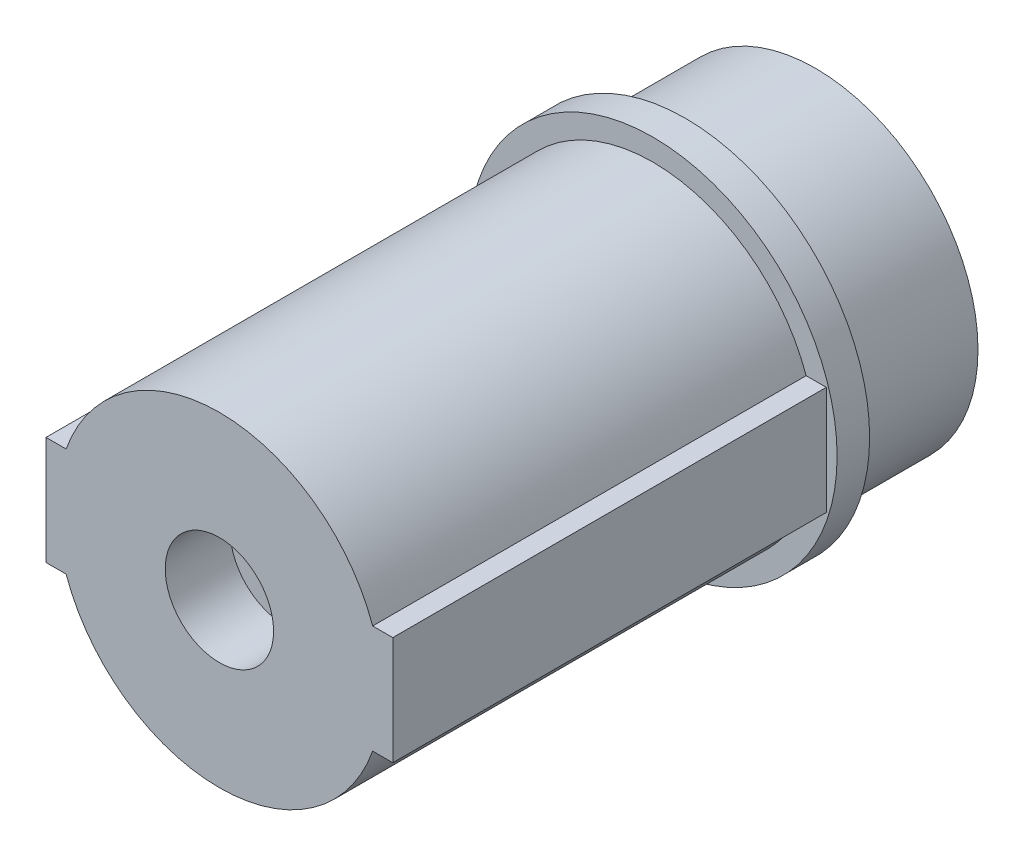
ISO-10303-21;
HEADER;
FILE_DESCRIPTION(('STEP AP214'),'2;1');
FILE_NAME('part.step','',(''),(''),'','','');
FILE_SCHEMA(('AUTOMOTIVE_DESIGN { 1 0 10303 214 1 1 1 1 }'));
ENDSEC;
DATA;
#1=APPLICATION_CONTEXT('core data for automotive mechanical design processes');
#2=APPLICATION_PROTOCOL_DEFINITION('international standard','automotive_design',2000,#1);
#3=PRODUCT_CONTEXT('',#1,'mechanical');
#4=PRODUCT('Part','Part','',(#3));
#5=PRODUCT_RELATED_PRODUCT_CATEGORY('part','',(#4));
#6=PRODUCT_DEFINITION_FORMATION('','',#4);
#7=PRODUCT_DEFINITION_CONTEXT('part definition',#1,'design');
#8=PRODUCT_DEFINITION('design','',#6,#7);
#9=PRODUCT_DEFINITION_SHAPE('','',#8);
#10=(LENGTH_UNIT() NAMED_UNIT(*) SI_UNIT(.MILLI.,.METRE.));
#11=(NAMED_UNIT(*) PLANE_ANGLE_UNIT() SI_UNIT($,.RADIAN.));
#12=(NAMED_UNIT(*) SI_UNIT($,.STERADIAN.) SOLID_ANGLE_UNIT());
#13=UNCERTAINTY_MEASURE_WITH_UNIT(LENGTH_MEASURE(1.E-05),#10,'distance_accuracy_value','');
#14=(GEOMETRIC_REPRESENTATION_CONTEXT(3) GLOBAL_UNCERTAINTY_ASSIGNED_CONTEXT((#13)) GLOBAL_UNIT_ASSIGNED_CONTEXT((#10,
#11,#12)) REPRESENTATION_CONTEXT('',''));
#15=CARTESIAN_POINT('',(0.,0.,0.));
#16=DIRECTION('',(0.,0.,1.));
#17=DIRECTION('',(1.,0.,0.));
#18=AXIS2_PLACEMENT_3D('',#15,#16,#17);
#19=CARTESIAN_POINT('',(0.,0.,55.));
#20=DIRECTION('',(0.,0.,-1.));
#21=DIRECTION('',(-1.,0.,0.));
#22=AXIS2_PLACEMENT_3D('',#19,#20,#21);
#23=CYLINDRICAL_SURFACE('',#22,15.);
#24=DIRECTION('',(0.,0.,1.));
#25=VECTOR('',#24,1.);
#26=CARTESIAN_POINT('',(-14.142135623731,-5.,15.));
#27=LINE('',#26,#25);
#28=CARTESIAN_POINT('',(-14.142135623731,-5.,15.));
#29=VERTEX_POINT('',#28);
#30=CARTESIAN_POINT('',(-14.142135623731,-5.,55.));
#31=VERTEX_POINT('',#30);
#32=EDGE_CURVE('E221',#29,#31,#27,.T.);
#33=ORIENTED_EDGE('',*,*,#32,.F.);
#34=CARTESIAN_POINT('',(0.,0.,15.));
#35=DIRECTION('',(0.,0.,1.));
#36=DIRECTION('',(1.,0.,0.));
#37=AXIS2_PLACEMENT_3D('',#34,#35,#36);
#38=CIRCLE('',#37,15.);
#39=CARTESIAN_POINT('',(14.142135623731,-5.,15.));
#40=VERTEX_POINT('',#39);
#41=EDGE_CURVE('E255',#29,#40,#38,.T.);
#42=ORIENTED_EDGE('',*,*,#41,.T.);
#43=DIRECTION('',(0.,0.,1.));
#44=VECTOR('',#43,1.);
#45=CARTESIAN_POINT('',(14.142135623731,-5.,15.));
#46=LINE('',#45,#44);
#47=CARTESIAN_POINT('',(14.142135623731,-5.,55.));
#48=VERTEX_POINT('',#47);
#49=EDGE_CURVE('E259',#40,#48,#46,.T.);
#50=ORIENTED_EDGE('',*,*,#49,.T.);
#51=CARTESIAN_POINT('',(0.,0.,55.));
#52=DIRECTION('',(0.,0.,1.));
#53=DIRECTION('',(1.,0.,0.));
#54=AXIS2_PLACEMENT_3D('',#51,#52,#53);
#55=CIRCLE('',#54,15.);
#56=EDGE_CURVE('E68',#31,#48,#55,.T.);
#57=ORIENTED_EDGE('',*,*,#56,.F.);
#58=EDGE_LOOP('',(#33,#42,#50,#57));
#59=FACE_BOUND('',#58,.T.);
#60=ADVANCED_FACE('F45',(#59),#23,.T.);
#61=DIRECTION('',(0.,0.,1.));
#62=VECTOR('',#61,1.);
#63=CARTESIAN_POINT('',(-14.142135623731,5.,15.));
#64=LINE('',#63,#62);
#65=CARTESIAN_POINT('',(-14.142135623731,5.,15.));
#66=VERTEX_POINT('',#65);
#67=CARTESIAN_POINT('',(-14.142135623731,5.,55.));
#68=VERTEX_POINT('',#67);
#69=EDGE_CURVE('E60',#66,#68,#64,.T.);
#70=ORIENTED_EDGE('',*,*,#69,.T.);
#71=CARTESIAN_POINT('',(14.1421356237309,5.,55.));
#72=VERTEX_POINT('',#71);
#73=EDGE_CURVE('E53',#72,#68,#55,.T.);
#74=ORIENTED_EDGE('',*,*,#73,.F.);
#75=DIRECTION('',(0.,0.,1.));
#76=VECTOR('',#75,1.);
#77=CARTESIAN_POINT('',(14.142135623731,5.,15.));
#78=LINE('',#77,#76);
#79=CARTESIAN_POINT('',(14.142135623731,5.,15.));
#80=VERTEX_POINT('',#79);
#81=EDGE_CURVE('E242',#80,#72,#78,.T.);
#82=ORIENTED_EDGE('',*,*,#81,.F.);
#83=EDGE_CURVE('E271',#80,#66,#38,.T.);
#84=ORIENTED_EDGE('',*,*,#83,.T.);
#85=EDGE_LOOP('',(#70,#74,#82,#84));
#86=FACE_BOUND('',#85,.T.);
#87=ADVANCED_FACE('F437',(#86),#23,.T.);
#88=CARTESIAN_POINT('',(0.,0.,15.));
#89=DIRECTION('',(0.,0.,1.));
#90=DIRECTION('',(1.,0.,0.));
#91=AXIS2_PLACEMENT_3D('',#88,#89,#90);
#92=PLANE('',#91);
#93=CARTESIAN_POINT('',(0.,0.,15.));
#94=DIRECTION('',(0.,0.,1.));
#95=DIRECTION('',(1.,0.,0.));
#96=AXIS2_PLACEMENT_3D('',#93,#94,#95);
#97=CIRCLE('',#96,17.);
#98=CARTESIAN_POINT('',(17.,0.,15.));
#99=VERTEX_POINT('',#98);
#100=EDGE_CURVE('E270',#99,#99,#97,.T.);
#101=ORIENTED_EDGE('',*,*,#100,.T.);
#102=EDGE_LOOP('',(#101));
#103=FACE_BOUND('',#102,.T.);
#104=ORIENTED_EDGE('',*,*,#41,.F.);
#105=DIRECTION('',(-1.,0.,0.));
#106=VECTOR('',#105,1.);
#107=CARTESIAN_POINT('',(0.,-5.,15.));
#108=LINE('',#107,#106);
#109=CARTESIAN_POINT('',(-16.,-5.,15.));
#110=VERTEX_POINT('',#109);
#111=EDGE_CURVE('E205',#29,#110,#108,.T.);
#112=ORIENTED_EDGE('',*,*,#111,.T.);
#113=DIRECTION('',(0.,-1.,0.));
#114=VECTOR('',#113,1.);
#115=CARTESIAN_POINT('',(-16.,0.,15.));
#116=LINE('',#115,#114);
#117=CARTESIAN_POINT('',(-16.,5.,15.));
#118=VERTEX_POINT('',#117);
#119=EDGE_CURVE('E187',#118,#110,#116,.T.);
#120=ORIENTED_EDGE('',*,*,#119,.F.);
#121=DIRECTION('',(1.,0.,0.));
#122=VECTOR('',#121,1.);
#123=CARTESIAN_POINT('',(0.,5.,15.));
#124=LINE('',#123,#122);
#125=EDGE_CURVE('E195',#118,#66,#124,.T.);
#126=ORIENTED_EDGE('',*,*,#125,.T.);
#127=ORIENTED_EDGE('',*,*,#83,.F.);
#128=DIRECTION('',(-1.,0.,0.));
#129=VECTOR('',#128,1.);
#130=CARTESIAN_POINT('',(0.,5.,15.));
#131=LINE('',#130,#129);
#132=CARTESIAN_POINT('',(16.,5.,15.));
#133=VERTEX_POINT('',#132);
#134=EDGE_CURVE('E230',#133,#80,#131,.T.);
#135=ORIENTED_EDGE('',*,*,#134,.F.);
#136=DIRECTION('',(0.,-1.,0.));
#137=VECTOR('',#136,1.);
#138=CARTESIAN_POINT('',(16.,0.,15.));
#139=LINE('',#138,#137);
#140=CARTESIAN_POINT('',(16.,-5.,15.));
#141=VERTEX_POINT('',#140);
#142=EDGE_CURVE('E239',#133,#141,#139,.T.);
#143=ORIENTED_EDGE('',*,*,#142,.T.);
#144=DIRECTION('',(1.,0.,0.));
#145=VECTOR('',#144,1.);
#146=CARTESIAN_POINT('',(0.,-5.,15.));
#147=LINE('',#146,#145);
#148=EDGE_CURVE('E234',#40,#141,#147,.T.);
#149=ORIENTED_EDGE('',*,*,#148,.F.);
#150=EDGE_LOOP('',(#104,#112,#120,#126,#127,#135,#143,#149));
#151=FACE_BOUND('',#150,.T.);
#152=ADVANCED_FACE('F204',(#103,#151),#92,.T.);
#153=CARTESIAN_POINT('',(0.,0.,0.));
#154=DIRECTION('',(0.,0.,1.));
#155=DIRECTION('',(1.,0.,0.));
#156=AXIS2_PLACEMENT_3D('',#153,#154,#155);
#157=CIRCLE('',#156,15.);
#158=CARTESIAN_POINT('',(15.,0.,0.));
#159=VERTEX_POINT('',#158);
#160=EDGE_CURVE('E405',#159,#159,#157,.T.);
#161=ORIENTED_EDGE('',*,*,#160,.T.);
#162=EDGE_LOOP('',(#161));
#163=FACE_BOUND('',#162,.T.);
#164=CARTESIAN_POINT('',(0.,0.,12.));
#165=DIRECTION('',(0.,0.,1.));
#166=DIRECTION('',(1.,0.,0.));
#167=AXIS2_PLACEMENT_3D('',#164,#165,#166);
#168=CIRCLE('',#167,15.);
#169=CARTESIAN_POINT('',(15.,0.,12.));
#170=VERTEX_POINT('',#169);
#171=EDGE_CURVE('E11',#170,#170,#168,.T.);
#172=ORIENTED_EDGE('',*,*,#171,.F.);
#173=EDGE_LOOP('',(#172));
#174=FACE_BOUND('',#173,.T.);
#175=ADVANCED_FACE('F417',(#163,#174),#23,.T.);
#176=CARTESIAN_POINT('',(0.,0.,46.));
#177=DIRECTION('',(0.,0.,-1.));
#178=DIRECTION('',(-1.,0.,0.));
#179=AXIS2_PLACEMENT_3D('',#176,#177,#178);
#180=CYLINDRICAL_SURFACE('',#179,10.);
#181=CARTESIAN_POINT('',(0.,0.,0.));
#182=DIRECTION('',(0.,0.,-1.));
#183=DIRECTION('',(-1.,0.,0.));
#184=AXIS2_PLACEMENT_3D('',#181,#182,#183);
#185=CIRCLE('',#184,10.);
#186=CARTESIAN_POINT('',(-10.,0.,0.));
#187=VERTEX_POINT('',#186);
#188=EDGE_CURVE('E397',#187,#187,#185,.T.);
#189=ORIENTED_EDGE('',*,*,#188,.T.);
#190=EDGE_LOOP('',(#189));
#191=FACE_BOUND('',#190,.T.);
#192=DIRECTION('',(0.,0.,1.));
#193=VECTOR('',#192,1.);
#194=CARTESIAN_POINT('',(-6.5,7.59934207678533,40.));
#195=LINE('',#194,#193);
#196=CARTESIAN_POINT('',(-6.5,7.59934207678533,40.));
#197=VERTEX_POINT('',#196);
#198=CARTESIAN_POINT('',(-6.5,7.59934207678533,46.));
#199=VERTEX_POINT('',#198);
#200=EDGE_CURVE('E269',#197,#199,#195,.T.);
#201=ORIENTED_EDGE('',*,*,#200,.F.);
#202=CARTESIAN_POINT('',(0.,0.,40.));
#203=DIRECTION('',(0.,0.,-1.));
#204=DIRECTION('',(-1.,0.,0.));
#205=AXIS2_PLACEMENT_3D('',#202,#203,#204);
#206=CIRCLE('',#205,10.);
#207=CARTESIAN_POINT('',(-9.68245836551854,2.5,40.));
#208=VERTEX_POINT('',#207);
#209=EDGE_CURVE('E291',#208,#197,#206,.T.);
#210=ORIENTED_EDGE('',*,*,#209,.F.);
#211=DIRECTION('',(0.,0.,1.));
#212=VECTOR('',#211,1.);
#213=CARTESIAN_POINT('',(-9.68245836551854,2.5,40.));
#214=LINE('',#213,#212);
#215=CARTESIAN_POINT('',(-9.68245836551854,2.5,46.));
#216=VERTEX_POINT('',#215);
#217=EDGE_CURVE('E282',#208,#216,#214,.T.);
#218=ORIENTED_EDGE('',*,*,#217,.T.);
#219=CARTESIAN_POINT('',(0.,0.,46.));
#220=DIRECTION('',(0.,0.,-1.));
#221=DIRECTION('',(-1.,0.,0.));
#222=AXIS2_PLACEMENT_3D('',#219,#220,#221);
#223=CIRCLE('',#222,10.);
#224=CARTESIAN_POINT('',(-9.68245836551854,-2.5,46.));
#225=VERTEX_POINT('',#224);
#226=EDGE_CURVE('E531',#225,#216,#223,.T.);
#227=ORIENTED_EDGE('',*,*,#226,.F.);
#228=DIRECTION('',(0.,0.,1.));
#229=VECTOR('',#228,1.);
#230=CARTESIAN_POINT('',(-9.68245836551854,-2.5,40.));
#231=LINE('',#230,#229);
#232=CARTESIAN_POINT('',(-9.68245836551854,-2.5,40.));
#233=VERTEX_POINT('',#232);
#234=EDGE_CURVE('E295',#233,#225,#231,.T.);
#235=ORIENTED_EDGE('',*,*,#234,.F.);
#236=CARTESIAN_POINT('',(0.,0.,40.));
#237=DIRECTION('',(0.,0.,-1.));
#238=DIRECTION('',(1.,0.,0.));
#239=AXIS2_PLACEMENT_3D('',#236,#237,#238);
#240=CIRCLE('',#239,10.);
#241=CARTESIAN_POINT('',(-6.5,-7.59934207678533,40.));
#242=VERTEX_POINT('',#241);
#243=EDGE_CURVE('E318',#242,#233,#240,.T.);
#244=ORIENTED_EDGE('',*,*,#243,.F.);
#245=DIRECTION('',(0.,0.,1.));
#246=VECTOR('',#245,1.);
#247=CARTESIAN_POINT('',(-6.5,-7.59934207678533,40.));
#248=LINE('',#247,#246);
#249=CARTESIAN_POINT('',(-6.5,-7.59934207678533,46.));
#250=VERTEX_POINT('',#249);
#251=EDGE_CURVE('E309',#242,#250,#248,.T.);
#252=ORIENTED_EDGE('',*,*,#251,.T.);
#253=CARTESIAN_POINT('',(6.5,-7.59934207678533,46.));
#254=VERTEX_POINT('',#253);
#255=EDGE_CURVE('E406',#254,#250,#223,.T.);
#256=ORIENTED_EDGE('',*,*,#255,.F.);
#257=DIRECTION('',(0.,0.,1.));
#258=VECTOR('',#257,1.);
#259=CARTESIAN_POINT('',(6.5,-7.59934207678533,40.));
#260=LINE('',#259,#258);
#261=CARTESIAN_POINT('',(6.5,-7.59934207678533,40.));
#262=VERTEX_POINT('',#261);
#263=EDGE_CURVE('E322',#262,#254,#260,.T.);
#264=ORIENTED_EDGE('',*,*,#263,.F.);
#265=CARTESIAN_POINT('',(0.,0.,40.));
#266=DIRECTION('',(0.,0.,-1.));
#267=DIRECTION('',(-1.,0.,0.));
#268=AXIS2_PLACEMENT_3D('',#265,#266,#267);
#269=CIRCLE('',#268,10.);
#270=CARTESIAN_POINT('',(9.68245836551854,-2.5,40.));
#271=VERTEX_POINT('',#270);
#272=EDGE_CURVE('E344',#271,#262,#269,.T.);
#273=ORIENTED_EDGE('',*,*,#272,.F.);
#274=DIRECTION('',(0.,0.,1.));
#275=VECTOR('',#274,1.);
#276=CARTESIAN_POINT('',(9.68245836551854,-2.5,40.));
#277=LINE('',#276,#275);
#278=CARTESIAN_POINT('',(9.68245836551854,-2.5,46.));
#279=VERTEX_POINT('',#278);
#280=EDGE_CURVE('E335',#271,#279,#277,.T.);
#281=ORIENTED_EDGE('',*,*,#280,.T.);
#282=CARTESIAN_POINT('',(9.68245836551854,2.5,46.));
#283=VERTEX_POINT('',#282);
#284=EDGE_CURVE('E401',#283,#279,#223,.T.);
#285=ORIENTED_EDGE('',*,*,#284,.F.);
#286=DIRECTION('',(0.,0.,1.));
#287=VECTOR('',#286,1.);
#288=CARTESIAN_POINT('',(9.68245836551854,2.5,40.));
#289=LINE('',#288,#287);
#290=CARTESIAN_POINT('',(9.68245836551854,2.5,40.));
#291=VERTEX_POINT('',#290);
#292=EDGE_CURVE('E381',#291,#283,#289,.T.);
#293=ORIENTED_EDGE('',*,*,#292,.F.);
#294=CARTESIAN_POINT('',(0.,0.,40.));
#295=DIRECTION('',(0.,0.,-1.));
#296=DIRECTION('',(1.,0.,0.));
#297=AXIS2_PLACEMENT_3D('',#294,#295,#296);
#298=CIRCLE('',#297,10.);
#299=CARTESIAN_POINT('',(6.5,7.59934207678533,40.));
#300=VERTEX_POINT('',#299);
#301=EDGE_CURVE('E357',#300,#291,#298,.T.);
#302=ORIENTED_EDGE('',*,*,#301,.F.);
#303=DIRECTION('',(0.,0.,1.));
#304=VECTOR('',#303,1.);
#305=CARTESIAN_POINT('',(6.5,7.59934207678533,40.));
#306=LINE('',#305,#304);
#307=CARTESIAN_POINT('',(6.5,7.59934207678533,46.));
#308=VERTEX_POINT('',#307);
#309=EDGE_CURVE('E368',#300,#308,#306,.T.);
#310=ORIENTED_EDGE('',*,*,#309,.T.);
#311=EDGE_CURVE('E407',#199,#308,#223,.T.);
#312=ORIENTED_EDGE('',*,*,#311,.F.);
#313=EDGE_LOOP('',(#201,#210,#218,#227,#235,#244,#252,#256,#264,#273,#281,#285,#293,#302,#310,#312));
#314=FACE_BOUND('',#313,.T.);
#315=ADVANCED_FACE('F445',(#191,#314),#180,.F.);
#316=CARTESIAN_POINT('',(0.,0.,46.));
#317=DIRECTION('',(0.,0.,-1.));
#318=DIRECTION('',(-1.,0.,0.));
#319=AXIS2_PLACEMENT_3D('',#316,#317,#318);
#320=PLANE('',#319);
#321=CARTESIAN_POINT('',(0.,0.,46.));
#322=DIRECTION('',(0.,0.,1.));
#323=DIRECTION('',(1.,0.,0.));
#324=AXIS2_PLACEMENT_3D('',#321,#322,#323);
#325=CIRCLE('',#324,2.25);
#326=CARTESIAN_POINT('',(2.25,0.,46.));
#327=VERTEX_POINT('',#326);
#328=EDGE_CURVE('E385',#327,#327,#325,.T.);
#329=ORIENTED_EDGE('',*,*,#328,.T.);
#330=EDGE_LOOP('',(#329));
#331=FACE_BOUND('',#330,.T.);
#332=DIRECTION('',(-1.,0.,0.));
#333=VECTOR('',#332,1.);
#334=CARTESIAN_POINT('',(-9.68245836551854,2.5,46.));
#335=LINE('',#334,#333);
#336=CARTESIAN_POINT('',(-6.5,2.5,46.));
#337=VERTEX_POINT('',#336);
#338=EDGE_CURVE('E287',#337,#216,#335,.T.);
#339=ORIENTED_EDGE('',*,*,#338,.F.);
#340=DIRECTION('',(0.,-1.,0.));
#341=VECTOR('',#340,1.);
#342=CARTESIAN_POINT('',(-6.5,2.5,46.));
#343=LINE('',#342,#341);
#344=EDGE_CURVE('E290',#199,#337,#343,.T.);
#345=ORIENTED_EDGE('',*,*,#344,.F.);
#346=ORIENTED_EDGE('',*,*,#311,.T.);
#347=DIRECTION('',(0.,1.,0.));
#348=VECTOR('',#347,1.);
#349=CARTESIAN_POINT('',(6.5,2.5,46.));
#350=LINE('',#349,#348);
#351=CARTESIAN_POINT('',(6.5,2.5,46.));
#352=VERTEX_POINT('',#351);
#353=EDGE_CURVE('E362',#352,#308,#350,.T.);
#354=ORIENTED_EDGE('',*,*,#353,.F.);
#355=DIRECTION('',(-1.,0.,0.));
#356=VECTOR('',#355,1.);
#357=CARTESIAN_POINT('',(9.68245836551854,2.5,46.));
#358=LINE('',#357,#356);
#359=EDGE_CURVE('E348',#283,#352,#358,.T.);
#360=ORIENTED_EDGE('',*,*,#359,.F.);
#361=ORIENTED_EDGE('',*,*,#284,.T.);
#362=DIRECTION('',(1.,0.,0.));
#363=VECTOR('',#362,1.);
#364=CARTESIAN_POINT('',(9.68245836551854,-2.5,46.));
#365=LINE('',#364,#363);
#366=CARTESIAN_POINT('',(6.5,-2.5,46.));
#367=VERTEX_POINT('',#366);
#368=EDGE_CURVE('E340',#367,#279,#365,.T.);
#369=ORIENTED_EDGE('',*,*,#368,.F.);
#370=DIRECTION('',(0.,1.,0.));
#371=VECTOR('',#370,1.);
#372=CARTESIAN_POINT('',(6.5,-2.5,46.));
#373=LINE('',#372,#371);
#374=EDGE_CURVE('E343',#254,#367,#373,.T.);
#375=ORIENTED_EDGE('',*,*,#374,.F.);
#376=ORIENTED_EDGE('',*,*,#255,.T.);
#377=DIRECTION('',(0.,-1.,0.));
#378=VECTOR('',#377,1.);
#379=CARTESIAN_POINT('',(-6.5,-2.5,46.));
#380=LINE('',#379,#378);
#381=CARTESIAN_POINT('',(-6.5,-2.5,46.));
#382=VERTEX_POINT('',#381);
#383=EDGE_CURVE('E314',#382,#250,#380,.T.);
#384=ORIENTED_EDGE('',*,*,#383,.F.);
#385=DIRECTION('',(1.,0.,0.));
#386=VECTOR('',#385,1.);
#387=CARTESIAN_POINT('',(-9.68245836551854,-2.5,46.));
#388=LINE('',#387,#386);
#389=EDGE_CURVE('E317',#225,#382,#388,.T.);
#390=ORIENTED_EDGE('',*,*,#389,.F.);
#391=ORIENTED_EDGE('',*,*,#226,.T.);
#392=EDGE_LOOP('',(#339,#345,#346,#354,#360,#361,#369,#375,#376,#384,#390,#391));
#393=FACE_BOUND('',#392,.T.);
#394=ADVANCED_FACE('F432',(#331,#393),#320,.T.);
#395=CARTESIAN_POINT('',(0.,0.,55.));
#396=DIRECTION('',(0.,0.,1.));
#397=DIRECTION('',(1.,0.,0.));
#398=AXIS2_PLACEMENT_3D('',#395,#396,#397);
#399=PLANE('',#398);
#400=CARTESIAN_POINT('',(0.,0.,55.));
#401=DIRECTION('',(0.,0.,1.));
#402=DIRECTION('',(1.,0.,0.));
#403=AXIS2_PLACEMENT_3D('',#400,#401,#402);
#404=CIRCLE('',#403,5.);
#405=CARTESIAN_POINT('',(5.,0.,55.));
#406=VERTEX_POINT('',#405);
#407=EDGE_CURVE('E389',#406,#406,#404,.T.);
#408=ORIENTED_EDGE('',*,*,#407,.F.);
#409=EDGE_LOOP('',(#408));
#410=FACE_BOUND('',#409,.T.);
#411=ORIENTED_EDGE('',*,*,#73,.T.);
#412=DIRECTION('',(1.,0.,0.));
#413=VECTOR('',#412,1.);
#414=CARTESIAN_POINT('',(0.,5.,55.));
#415=LINE('',#414,#413);
#416=CARTESIAN_POINT('',(-16.,5.,55.));
#417=VERTEX_POINT('',#416);
#418=EDGE_CURVE('E213',#417,#68,#415,.T.);
#419=ORIENTED_EDGE('',*,*,#418,.F.);
#420=DIRECTION('',(0.,-1.,0.));
#421=VECTOR('',#420,1.);
#422=CARTESIAN_POINT('',(-16.,0.,55.));
#423=LINE('',#422,#421);
#424=CARTESIAN_POINT('',(-16.,-5.,55.));
#425=VERTEX_POINT('',#424);
#426=EDGE_CURVE('E190',#417,#425,#423,.T.);
#427=ORIENTED_EDGE('',*,*,#426,.T.);
#428=DIRECTION('',(-1.,0.,0.));
#429=VECTOR('',#428,1.);
#430=CARTESIAN_POINT('',(0.,-5.,55.));
#431=LINE('',#430,#429);
#432=EDGE_CURVE('E201',#31,#425,#431,.T.);
#433=ORIENTED_EDGE('',*,*,#432,.F.);
#434=ORIENTED_EDGE('',*,*,#56,.T.);
#435=DIRECTION('',(1.,0.,0.));
#436=VECTOR('',#435,1.);
#437=CARTESIAN_POINT('',(0.,-5.,55.));
#438=LINE('',#437,#436);
#439=CARTESIAN_POINT('',(16.,-5.,55.));
#440=VERTEX_POINT('',#439);
#441=EDGE_CURVE('E246',#48,#440,#438,.T.);
#442=ORIENTED_EDGE('',*,*,#441,.T.);
#443=DIRECTION('',(0.,-1.,0.));
#444=VECTOR('',#443,1.);
#445=CARTESIAN_POINT('',(16.,0.,55.));
#446=LINE('',#445,#444);
#447=CARTESIAN_POINT('',(16.,5.,55.));
#448=VERTEX_POINT('',#447);
#449=EDGE_CURVE('E235',#448,#440,#446,.T.);
#450=ORIENTED_EDGE('',*,*,#449,.F.);
#451=DIRECTION('',(-1.,0.,0.));
#452=VECTOR('',#451,1.);
#453=CARTESIAN_POINT('',(0.,5.,55.));
#454=LINE('',#453,#452);
#455=EDGE_CURVE('E225',#448,#72,#454,.T.);
#456=ORIENTED_EDGE('',*,*,#455,.T.);
#457=EDGE_LOOP('',(#411,#419,#427,#433,#434,#442,#450,#456));
#458=FACE_BOUND('',#457,.T.);
#459=ADVANCED_FACE('F423',(#410,#458),#399,.T.);
#460=CARTESIAN_POINT('',(0.,0.,0.));
#461=DIRECTION('',(0.,0.,1.));
#462=DIRECTION('',(1.,0.,0.));
#463=AXIS2_PLACEMENT_3D('',#460,#461,#462);
#464=PLANE('',#463);
#465=ORIENTED_EDGE('',*,*,#188,.F.);
#466=EDGE_LOOP('',(#465));
#467=FACE_BOUND('',#466,.T.);
#468=ORIENTED_EDGE('',*,*,#160,.F.);
#469=EDGE_LOOP('',(#468));
#470=FACE_BOUND('',#469,.T.);
#471=ADVANCED_FACE('F420',(#467,#470),#464,.F.);
#472=CARTESIAN_POINT('',(0.,0.,49.));
#473=DIRECTION('',(0.,0.,1.));
#474=DIRECTION('',(1.,0.,0.));
#475=AXIS2_PLACEMENT_3D('',#472,#473,#474);
#476=CYLINDRICAL_SURFACE('',#475,5.);
#477=CARTESIAN_POINT('',(0.,0.,49.));
#478=DIRECTION('',(0.,0.,1.));
#479=DIRECTION('',(1.,0.,0.));
#480=AXIS2_PLACEMENT_3D('',#477,#478,#479);
#481=CIRCLE('',#480,5.);
#482=CARTESIAN_POINT('',(5.,0.,49.));
#483=VERTEX_POINT('',#482);
#484=EDGE_CURVE('E393',#483,#483,#481,.T.);
#485=ORIENTED_EDGE('',*,*,#484,.F.);
#486=EDGE_LOOP('',(#485));
#487=FACE_BOUND('',#486,.T.);
#488=ORIENTED_EDGE('',*,*,#407,.T.);
#489=EDGE_LOOP('',(#488));
#490=FACE_BOUND('',#489,.T.);
#491=ADVANCED_FACE('F422',(#487,#490),#476,.F.);
#492=CARTESIAN_POINT('',(0.,0.,49.));
#493=DIRECTION('',(0.,0.,1.));
#494=DIRECTION('',(1.,0.,0.));
#495=AXIS2_PLACEMENT_3D('',#492,#493,#494);
#496=PLANE('',#495);
#497=CARTESIAN_POINT('',(0.,0.,49.));
#498=DIRECTION('',(0.,0.,1.));
#499=DIRECTION('',(1.,0.,0.));
#500=AXIS2_PLACEMENT_3D('',#497,#498,#499);
#501=CIRCLE('',#500,2.25);
#502=CARTESIAN_POINT('',(2.25,0.,49.));
#503=VERTEX_POINT('',#502);
#504=EDGE_CURVE('E384',#503,#503,#501,.T.);
#505=ORIENTED_EDGE('',*,*,#504,.F.);
#506=EDGE_LOOP('',(#505));
#507=FACE_BOUND('',#506,.T.);
#508=ORIENTED_EDGE('',*,*,#484,.T.);
#509=EDGE_LOOP('',(#508));
#510=FACE_BOUND('',#509,.T.);
#511=ADVANCED_FACE('F429',(#507,#510),#496,.T.);
#512=CARTESIAN_POINT('',(0.,0.,46.));
#513=DIRECTION('',(0.,0.,1.));
#514=DIRECTION('',(1.,0.,0.));
#515=AXIS2_PLACEMENT_3D('',#512,#513,#514);
#516=CYLINDRICAL_SURFACE('',#515,2.25);
#517=ORIENTED_EDGE('',*,*,#328,.F.);
#518=EDGE_LOOP('',(#517));
#519=FACE_BOUND('',#518,.T.);
#520=ORIENTED_EDGE('',*,*,#504,.T.);
#521=EDGE_LOOP('',(#520));
#522=FACE_BOUND('',#521,.T.);
#523=ADVANCED_FACE('F511',(#519,#522),#516,.F.);
#524=CARTESIAN_POINT('',(9.68245836551854,2.5,40.));
#525=DIRECTION('',(0.,1.,0.));
#526=DIRECTION('',(0.,0.,1.));
#527=AXIS2_PLACEMENT_3D('',#524,#525,#526);
#528=PLANE('',#527);
#529=ORIENTED_EDGE('',*,*,#359,.T.);
#530=DIRECTION('',(0.,0.,1.));
#531=VECTOR('',#530,1.);
#532=CARTESIAN_POINT('',(6.5,2.5,40.));
#533=LINE('',#532,#531);
#534=CARTESIAN_POINT('',(6.5,2.5,40.));
#535=VERTEX_POINT('',#534);
#536=EDGE_CURVE('E378',#535,#352,#533,.T.);
#537=ORIENTED_EDGE('',*,*,#536,.F.);
#538=DIRECTION('',(-1.,0.,0.));
#539=VECTOR('',#538,1.);
#540=CARTESIAN_POINT('',(9.68245836551854,2.5,40.));
#541=LINE('',#540,#539);
#542=EDGE_CURVE('E361',#291,#535,#541,.T.);
#543=ORIENTED_EDGE('',*,*,#542,.F.);
#544=ORIENTED_EDGE('',*,*,#292,.T.);
#545=EDGE_LOOP('',(#529,#537,#543,#544));
#546=FACE_BOUND('',#545,.T.);
#547=ADVANCED_FACE('F507',(#546),#528,.F.);
#548=CARTESIAN_POINT('',(6.5,2.5,40.));
#549=DIRECTION('',(1.,0.,0.));
#550=DIRECTION('',(0.,1.,0.));
#551=AXIS2_PLACEMENT_3D('',#548,#549,#550);
#552=PLANE('',#551);
#553=ORIENTED_EDGE('',*,*,#353,.T.);
#554=ORIENTED_EDGE('',*,*,#309,.F.);
#555=DIRECTION('',(0.,1.,0.));
#556=VECTOR('',#555,1.);
#557=CARTESIAN_POINT('',(6.5,2.5,40.));
#558=LINE('',#557,#556);
#559=EDGE_CURVE('E365',#535,#300,#558,.T.);
#560=ORIENTED_EDGE('',*,*,#559,.F.);
#561=ORIENTED_EDGE('',*,*,#536,.T.);
#562=EDGE_LOOP('',(#553,#554,#560,#561));
#563=FACE_BOUND('',#562,.T.);
#564=ADVANCED_FACE('F503',(#563),#552,.F.);
#565=CARTESIAN_POINT('',(0.,0.,40.));
#566=DIRECTION('',(0.,0.,1.));
#567=DIRECTION('',(1.,0.,0.));
#568=AXIS2_PLACEMENT_3D('',#565,#566,#567);
#569=PLANE('',#568);
#570=ORIENTED_EDGE('',*,*,#301,.T.);
#571=ORIENTED_EDGE('',*,*,#542,.T.);
#572=ORIENTED_EDGE('',*,*,#559,.T.);
#573=EDGE_LOOP('',(#570,#571,#572));
#574=FACE_BOUND('',#573,.T.);
#575=ADVANCED_FACE('F493',(#574),#569,.F.);
#576=CARTESIAN_POINT('',(6.5,-2.5,40.));
#577=DIRECTION('',(1.,0.,0.));
#578=DIRECTION('',(0.,1.,0.));
#579=AXIS2_PLACEMENT_3D('',#576,#577,#578);
#580=PLANE('',#579);
#581=ORIENTED_EDGE('',*,*,#374,.T.);
#582=DIRECTION('',(0.,0.,1.));
#583=VECTOR('',#582,1.);
#584=CARTESIAN_POINT('',(6.5,-2.5,40.));
#585=LINE('',#584,#583);
#586=CARTESIAN_POINT('',(6.5,-2.5,40.));
#587=VERTEX_POINT('',#586);
#588=EDGE_CURVE('E332',#587,#367,#585,.T.);
#589=ORIENTED_EDGE('',*,*,#588,.F.);
#590=DIRECTION('',(0.,1.,0.));
#591=VECTOR('',#590,1.);
#592=CARTESIAN_POINT('',(6.5,-2.5,40.));
#593=LINE('',#592,#591);
#594=EDGE_CURVE('E351',#262,#587,#593,.T.);
#595=ORIENTED_EDGE('',*,*,#594,.F.);
#596=ORIENTED_EDGE('',*,*,#263,.T.);
#597=EDGE_LOOP('',(#581,#589,#595,#596));
#598=FACE_BOUND('',#597,.T.);
#599=ADVANCED_FACE('F489',(#598),#580,.F.);
#600=CARTESIAN_POINT('',(9.68245836551854,-2.5,40.));
#601=DIRECTION('',(0.,-1.,0.));
#602=DIRECTION('',(0.,0.,-1.));
#603=AXIS2_PLACEMENT_3D('',#600,#601,#602);
#604=PLANE('',#603);
#605=ORIENTED_EDGE('',*,*,#368,.T.);
#606=ORIENTED_EDGE('',*,*,#280,.F.);
#607=DIRECTION('',(1.,0.,0.));
#608=VECTOR('',#607,1.);
#609=CARTESIAN_POINT('',(9.68245836551854,-2.5,40.));
#610=LINE('',#609,#608);
#611=EDGE_CURVE('E339',#587,#271,#610,.T.);
#612=ORIENTED_EDGE('',*,*,#611,.F.);
#613=ORIENTED_EDGE('',*,*,#588,.T.);
#614=EDGE_LOOP('',(#605,#606,#612,#613));
#615=FACE_BOUND('',#614,.T.);
#616=ADVANCED_FACE('F492',(#615),#604,.F.);
#617=CARTESIAN_POINT('',(0.,0.,40.));
#618=DIRECTION('',(0.,0.,-1.));
#619=DIRECTION('',(-1.,0.,0.));
#620=AXIS2_PLACEMENT_3D('',#617,#618,#619);
#621=PLANE('',#620);
#622=ORIENTED_EDGE('',*,*,#272,.T.);
#623=ORIENTED_EDGE('',*,*,#594,.T.);
#624=ORIENTED_EDGE('',*,*,#611,.T.);
#625=EDGE_LOOP('',(#622,#623,#624));
#626=FACE_BOUND('',#625,.T.);
#627=ADVANCED_FACE('F481',(#626),#621,.T.);
#628=CARTESIAN_POINT('',(-9.68245836551854,-2.5,40.));
#629=DIRECTION('',(0.,-1.,0.));
#630=DIRECTION('',(0.,0.,-1.));
#631=AXIS2_PLACEMENT_3D('',#628,#629,#630);
#632=PLANE('',#631);
#633=ORIENTED_EDGE('',*,*,#389,.T.);
#634=DIRECTION('',(0.,0.,1.));
#635=VECTOR('',#634,1.);
#636=CARTESIAN_POINT('',(-6.5,-2.5,40.));
#637=LINE('',#636,#635);
#638=CARTESIAN_POINT('',(-6.5,-2.5,40.));
#639=VERTEX_POINT('',#638);
#640=EDGE_CURVE('E306',#639,#382,#637,.T.);
#641=ORIENTED_EDGE('',*,*,#640,.F.);
#642=DIRECTION('',(1.,0.,0.));
#643=VECTOR('',#642,1.);
#644=CARTESIAN_POINT('',(-9.68245836551854,-2.5,40.));
#645=LINE('',#644,#643);
#646=EDGE_CURVE('E325',#233,#639,#645,.T.);
#647=ORIENTED_EDGE('',*,*,#646,.F.);
#648=ORIENTED_EDGE('',*,*,#234,.T.);
#649=EDGE_LOOP('',(#633,#641,#647,#648));
#650=FACE_BOUND('',#649,.T.);
#651=ADVANCED_FACE('F477',(#650),#632,.F.);
#652=CARTESIAN_POINT('',(-6.5,-2.5,40.));
#653=DIRECTION('',(-1.,0.,0.));
#654=DIRECTION('',(0.,-1.,0.));
#655=AXIS2_PLACEMENT_3D('',#652,#653,#654);
#656=PLANE('',#655);
#657=ORIENTED_EDGE('',*,*,#383,.T.);
#658=ORIENTED_EDGE('',*,*,#251,.F.);
#659=DIRECTION('',(0.,-1.,0.));
#660=VECTOR('',#659,1.);
#661=CARTESIAN_POINT('',(-6.5,-2.5,40.));
#662=LINE('',#661,#660);
#663=EDGE_CURVE('E313',#639,#242,#662,.T.);
#664=ORIENTED_EDGE('',*,*,#663,.F.);
#665=ORIENTED_EDGE('',*,*,#640,.T.);
#666=EDGE_LOOP('',(#657,#658,#664,#665));
#667=FACE_BOUND('',#666,.T.);
#668=ADVANCED_FACE('F480',(#667),#656,.F.);
#669=CARTESIAN_POINT('',(0.,0.,40.));
#670=DIRECTION('',(0.,0.,1.));
#671=DIRECTION('',(1.,0.,0.));
#672=AXIS2_PLACEMENT_3D('',#669,#670,#671);
#673=PLANE('',#672);
#674=ORIENTED_EDGE('',*,*,#243,.T.);
#675=ORIENTED_EDGE('',*,*,#646,.T.);
#676=ORIENTED_EDGE('',*,*,#663,.T.);
#677=EDGE_LOOP('',(#674,#675,#676));
#678=FACE_BOUND('',#677,.T.);
#679=ADVANCED_FACE('F469',(#678),#673,.F.);
#680=CARTESIAN_POINT('',(-6.5,2.5,40.));
#681=DIRECTION('',(-1.,0.,0.));
#682=DIRECTION('',(0.,-1.,0.));
#683=AXIS2_PLACEMENT_3D('',#680,#681,#682);
#684=PLANE('',#683);
#685=ORIENTED_EDGE('',*,*,#344,.T.);
#686=DIRECTION('',(0.,0.,1.));
#687=VECTOR('',#686,1.);
#688=CARTESIAN_POINT('',(-6.5,2.5,40.));
#689=LINE('',#688,#687);
#690=CARTESIAN_POINT('',(-6.5,2.5,40.));
#691=VERTEX_POINT('',#690);
#692=EDGE_CURVE('E279',#691,#337,#689,.T.);
#693=ORIENTED_EDGE('',*,*,#692,.F.);
#694=DIRECTION('',(0.,-1.,0.));
#695=VECTOR('',#694,1.);
#696=CARTESIAN_POINT('',(-6.5,2.5,40.));
#697=LINE('',#696,#695);
#698=EDGE_CURVE('E298',#197,#691,#697,.T.);
#699=ORIENTED_EDGE('',*,*,#698,.F.);
#700=ORIENTED_EDGE('',*,*,#200,.T.);
#701=EDGE_LOOP('',(#685,#693,#699,#700));
#702=FACE_BOUND('',#701,.T.);
#703=ADVANCED_FACE('F465',(#702),#684,.F.);
#704=CARTESIAN_POINT('',(-9.68245836551854,2.5,40.));
#705=DIRECTION('',(0.,1.,0.));
#706=DIRECTION('',(0.,0.,1.));
#707=AXIS2_PLACEMENT_3D('',#704,#705,#706);
#708=PLANE('',#707);
#709=ORIENTED_EDGE('',*,*,#338,.T.);
#710=ORIENTED_EDGE('',*,*,#217,.F.);
#711=DIRECTION('',(-1.,0.,0.));
#712=VECTOR('',#711,1.);
#713=CARTESIAN_POINT('',(-9.68245836551854,2.5,40.));
#714=LINE('',#713,#712);
#715=EDGE_CURVE('E286',#691,#208,#714,.T.);
#716=ORIENTED_EDGE('',*,*,#715,.F.);
#717=ORIENTED_EDGE('',*,*,#692,.T.);
#718=EDGE_LOOP('',(#709,#710,#716,#717));
#719=FACE_BOUND('',#718,.T.);
#720=ADVANCED_FACE('F468',(#719),#708,.F.);
#721=CARTESIAN_POINT('',(0.,0.,40.));
#722=DIRECTION('',(0.,0.,-1.));
#723=DIRECTION('',(-1.,0.,0.));
#724=AXIS2_PLACEMENT_3D('',#721,#722,#723);
#725=PLANE('',#724);
#726=ORIENTED_EDGE('',*,*,#209,.T.);
#727=ORIENTED_EDGE('',*,*,#698,.T.);
#728=ORIENTED_EDGE('',*,*,#715,.T.);
#729=EDGE_LOOP('',(#726,#727,#728));
#730=FACE_BOUND('',#729,.T.);
#731=ADVANCED_FACE('F463',(#730),#725,.T.);
#732=CARTESIAN_POINT('',(0.,0.,12.));
#733=DIRECTION('',(0.,0.,1.));
#734=DIRECTION('',(1.,0.,0.));
#735=AXIS2_PLACEMENT_3D('',#732,#733,#734);
#736=CYLINDRICAL_SURFACE('',#735,17.);
#737=CARTESIAN_POINT('',(0.,0.,12.));
#738=DIRECTION('',(0.,0.,1.));
#739=DIRECTION('',(1.,0.,0.));
#740=AXIS2_PLACEMENT_3D('',#737,#738,#739);
#741=CIRCLE('',#740,17.);
#742=CARTESIAN_POINT('',(17.,0.,12.));
#743=VERTEX_POINT('',#742);
#744=EDGE_CURVE('E265',#743,#743,#741,.T.);
#745=ORIENTED_EDGE('',*,*,#744,.T.);
#746=EDGE_LOOP('',(#745));
#747=FACE_BOUND('',#746,.T.);
#748=ORIENTED_EDGE('',*,*,#100,.F.);
#749=EDGE_LOOP('',(#748));
#750=FACE_BOUND('',#749,.T.);
#751=ADVANCED_FACE('F460',(#747,#750),#736,.T.);
#752=CARTESIAN_POINT('',(0.,0.,12.));
#753=DIRECTION('',(0.,0.,1.));
#754=DIRECTION('',(1.,0.,0.));
#755=AXIS2_PLACEMENT_3D('',#752,#753,#754);
#756=PLANE('',#755);
#757=ORIENTED_EDGE('',*,*,#171,.T.);
#758=EDGE_LOOP('',(#757));
#759=FACE_BOUND('',#758,.T.);
#760=ORIENTED_EDGE('',*,*,#744,.F.);
#761=EDGE_LOOP('',(#760));
#762=FACE_BOUND('',#761,.T.);
#763=ADVANCED_FACE('F458',(#759,#762),#756,.F.);
#764=CARTESIAN_POINT('',(0.,5.,15.));
#765=DIRECTION('',(0.,1.,0.));
#766=DIRECTION('',(0.,0.,1.));
#767=AXIS2_PLACEMENT_3D('',#764,#765,#766);
#768=PLANE('',#767);
#769=ORIENTED_EDGE('',*,*,#455,.F.);
#770=DIRECTION('',(0.,0.,1.));
#771=VECTOR('',#770,1.);
#772=CARTESIAN_POINT('',(16.,5.,15.));
#773=LINE('',#772,#771);
#774=EDGE_CURVE('E252',#133,#448,#773,.T.);
#775=ORIENTED_EDGE('',*,*,#774,.F.);
#776=ORIENTED_EDGE('',*,*,#134,.T.);
#777=ORIENTED_EDGE('',*,*,#81,.T.);
#778=EDGE_LOOP('',(#769,#775,#776,#777));
#779=FACE_BOUND('',#778,.T.);
#780=ADVANCED_FACE('F573',(#779),#768,.T.);
#781=CARTESIAN_POINT('',(16.,0.,15.));
#782=DIRECTION('',(-1.,0.,0.));
#783=DIRECTION('',(0.,0.,1.));
#784=AXIS2_PLACEMENT_3D('',#781,#782,#783);
#785=PLANE('',#784);
#786=ORIENTED_EDGE('',*,*,#449,.T.);
#787=DIRECTION('',(0.,0.,1.));
#788=VECTOR('',#787,1.);
#789=CARTESIAN_POINT('',(16.,-5.,15.));
#790=LINE('',#789,#788);
#791=EDGE_CURVE('E256',#141,#440,#790,.T.);
#792=ORIENTED_EDGE('',*,*,#791,.F.);
#793=ORIENTED_EDGE('',*,*,#142,.F.);
#794=ORIENTED_EDGE('',*,*,#774,.T.);
#795=EDGE_LOOP('',(#786,#792,#793,#794));
#796=FACE_BOUND('',#795,.T.);
#797=ADVANCED_FACE('F580',(#796),#785,.F.);
#798=CARTESIAN_POINT('',(0.,-5.,15.));
#799=DIRECTION('',(0.,-1.,0.));
#800=DIRECTION('',(0.,0.,-1.));
#801=AXIS2_PLACEMENT_3D('',#798,#799,#800);
#802=PLANE('',#801);
#803=ORIENTED_EDGE('',*,*,#441,.F.);
#804=ORIENTED_EDGE('',*,*,#49,.F.);
#805=ORIENTED_EDGE('',*,*,#148,.T.);
#806=ORIENTED_EDGE('',*,*,#791,.T.);
#807=EDGE_LOOP('',(#803,#804,#805,#806));
#808=FACE_BOUND('',#807,.T.);
#809=ADVANCED_FACE('F583',(#808),#802,.T.);
#810=CARTESIAN_POINT('',(0.,-5.,15.));
#811=DIRECTION('',(0.,1.,0.));
#812=DIRECTION('',(0.,0.,1.));
#813=AXIS2_PLACEMENT_3D('',#810,#811,#812);
#814=PLANE('',#813);
#815=ORIENTED_EDGE('',*,*,#432,.T.);
#816=DIRECTION('',(0.,0.,1.));
#817=VECTOR('',#816,1.);
#818=CARTESIAN_POINT('',(-16.,-5.,15.));
#819=LINE('',#818,#817);
#820=EDGE_CURVE('E193',#110,#425,#819,.T.);
#821=ORIENTED_EDGE('',*,*,#820,.F.);
#822=ORIENTED_EDGE('',*,*,#111,.F.);
#823=ORIENTED_EDGE('',*,*,#32,.T.);
#824=EDGE_LOOP('',(#815,#821,#822,#823));
#825=FACE_BOUND('',#824,.T.);
#826=ADVANCED_FACE('F586',(#825),#814,.F.);
#827=CARTESIAN_POINT('',(-16.,0.,15.));
#828=DIRECTION('',(-1.,0.,0.));
#829=DIRECTION('',(0.,0.,1.));
#830=AXIS2_PLACEMENT_3D('',#827,#828,#829);
#831=PLANE('',#830);
#832=ORIENTED_EDGE('',*,*,#426,.F.);
#833=DIRECTION('',(0.,0.,1.));
#834=VECTOR('',#833,1.);
#835=CARTESIAN_POINT('',(-16.,5.,15.));
#836=LINE('',#835,#834);
#837=EDGE_CURVE('E184',#118,#417,#836,.T.);
#838=ORIENTED_EDGE('',*,*,#837,.F.);
#839=ORIENTED_EDGE('',*,*,#119,.T.);
#840=ORIENTED_EDGE('',*,*,#820,.T.);
#841=EDGE_LOOP('',(#832,#838,#839,#840));
#842=FACE_BOUND('',#841,.T.);
#843=ADVANCED_FACE('F185',(#842),#831,.T.);
#844=CARTESIAN_POINT('',(0.,5.,15.));
#845=DIRECTION('',(0.,-1.,0.));
#846=DIRECTION('',(0.,0.,-1.));
#847=AXIS2_PLACEMENT_3D('',#844,#845,#846);
#848=PLANE('',#847);
#849=ORIENTED_EDGE('',*,*,#418,.T.);
#850=ORIENTED_EDGE('',*,*,#69,.F.);
#851=ORIENTED_EDGE('',*,*,#125,.F.);
#852=ORIENTED_EDGE('',*,*,#837,.T.);
#853=EDGE_LOOP('',(#849,#850,#851,#852));
#854=FACE_BOUND('',#853,.T.);
#855=ADVANCED_FACE('F196',(#854),#848,.F.);
#856=CLOSED_SHELL('',(#60,#87,#152,#175,#315,#394,#459,#471,#491,#511,#523,#547,#564,#575,#599,
#616,#627,#651,#668,#679,#703,#720,#731,#751,#763,#780,#797,#809,#826,#843,#855));
#857=MANIFOLD_SOLID_BREP('B2',#856);
#858=ADVANCED_BREP_SHAPE_REPRESENTATION('',(#18,#857),#14);
#859=SHAPE_DEFINITION_REPRESENTATION(#9,#858);
ENDSEC;
END-ISO-10303-21;
